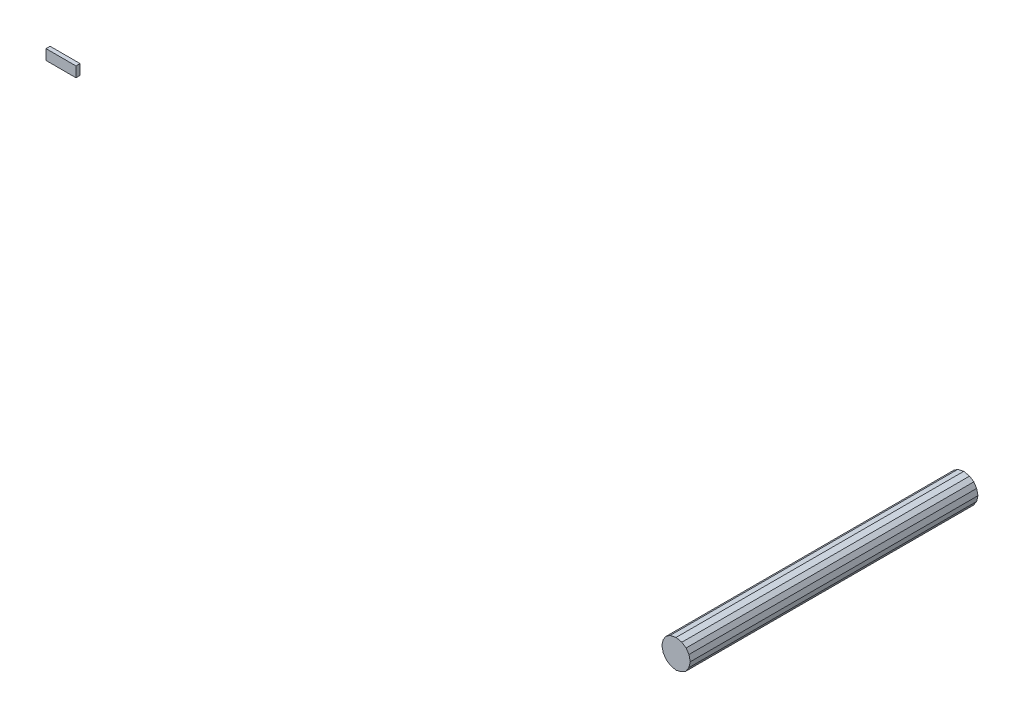
ISO-10303-21;
HEADER;
FILE_DESCRIPTION(('STEP AP214'),'2;1');
FILE_NAME('part.step','',(''),(''),'','','');
FILE_SCHEMA(('AUTOMOTIVE_DESIGN { 1 0 10303 214 1 1 1 1 }'));
ENDSEC;
DATA;
#1=APPLICATION_CONTEXT('core data for automotive mechanical design processes');
#2=APPLICATION_PROTOCOL_DEFINITION('international standard','automotive_design',2000,#1);
#3=PRODUCT_CONTEXT('',#1,'mechanical');
#4=PRODUCT('Part','Part','',(#3));
#5=PRODUCT_RELATED_PRODUCT_CATEGORY('part','',(#4));
#6=PRODUCT_DEFINITION_FORMATION('','',#4);
#7=PRODUCT_DEFINITION_CONTEXT('part definition',#1,'design');
#8=PRODUCT_DEFINITION('design','',#6,#7);
#9=PRODUCT_DEFINITION_SHAPE('','',#8);
#10=(LENGTH_UNIT() NAMED_UNIT(*) SI_UNIT(.MILLI.,.METRE.));
#11=(NAMED_UNIT(*) PLANE_ANGLE_UNIT() SI_UNIT($,.RADIAN.));
#12=(NAMED_UNIT(*) SI_UNIT($,.STERADIAN.) SOLID_ANGLE_UNIT());
#13=UNCERTAINTY_MEASURE_WITH_UNIT(LENGTH_MEASURE(1.E-05),#10,'distance_accuracy_value','');
#14=(GEOMETRIC_REPRESENTATION_CONTEXT(3) GLOBAL_UNCERTAINTY_ASSIGNED_CONTEXT((#13)) GLOBAL_UNIT_ASSIGNED_CONTEXT((#10,
#11,#12)) REPRESENTATION_CONTEXT('',''));
#15=CARTESIAN_POINT('',(0.,0.,0.));
#16=DIRECTION('',(0.,0.,1.));
#17=DIRECTION('',(1.,0.,0.));
#18=AXIS2_PLACEMENT_3D('',#15,#16,#17);
#19=CARTESIAN_POINT('',(37.113689223164,20.449887465869,9.000000650735));
#20=DIRECTION('',(0.,0.,1.));
#21=DIRECTION('',(1.,0.,0.));
#22=AXIS2_PLACEMENT_3D('',#19,#20,#21);
#23=PLANE('',#22);
#24=DIRECTION('',(-0.860789441871855,-0.508961233063914,0.));
#25=VECTOR('',#24,1.);
#26=CARTESIAN_POINT('',(37.294715023164,20.556923065869,9.000000650735));
#27=LINE('',#26,#25);
#28=CARTESIAN_POINT('',(37.294715023164,20.556923065869,9.000000650735));
#29=VERTEX_POINT('',#28);
#30=CARTESIAN_POINT('',(37.113689223164,20.449887465869,9.000000650735));
#31=VERTEX_POINT('',#30);
#32=EDGE_CURVE('P0_E26',#29,#31,#27,.T.);
#33=ORIENTED_EDGE('',*,*,#32,.F.);
#34=DIRECTION('',(-0.539246404118153,-0.842148036657239,0.));
#35=VECTOR('',#34,1.);
#36=CARTESIAN_POINT('',(37.405636823164,20.730151065869,9.000000650735));
#37=LINE('',#36,#35);
#38=CARTESIAN_POINT('',(37.405636823164,20.730151065869,9.000000650735));
#39=VERTEX_POINT('',#38);
#40=EDGE_CURVE('P0_E184',#39,#29,#37,.T.);
#41=ORIENTED_EDGE('',*,*,#40,.F.);
#42=DIRECTION('',(-0.707106781186548,-0.707106781186548,0.));
#43=VECTOR('',#42,1.);
#44=CARTESIAN_POINT('',(37.415390423164,20.739904665869,9.000000650735));
#45=LINE('',#44,#43);
#46=CARTESIAN_POINT('',(37.415390423164,20.739904665869,9.000000650735));
#47=VERTEX_POINT('',#46);
#48=EDGE_CURVE('P0_E186',#47,#39,#45,.T.);
#49=ORIENTED_EDGE('',*,*,#48,.F.);
#50=DIRECTION('',(-0.228497344288947,-0.973544536039774,0.));
#51=VECTOR('',#50,1.);
#52=CARTESIAN_POINT('',(37.467917623164,20.963704065869,9.000000650735));
#53=LINE('',#52,#51);
#54=CARTESIAN_POINT('',(37.467917623164,20.963704065869,9.000000650735));
#55=VERTEX_POINT('',#54);
#56=EDGE_CURVE('P0_E214',#55,#47,#53,.T.);
#57=ORIENTED_EDGE('',*,*,#56,.F.);
#58=DIRECTION('',(0.234264017035985,-0.972173014602938,0.));
#59=VECTOR('',#58,1.);
#60=CARTESIAN_POINT('',(37.415390423164,21.181686865869,9.000000650735));
#61=LINE('',#60,#59);
#62=CARTESIAN_POINT('',(37.415390423164,21.181686865869,9.000000650735));
#63=VERTEX_POINT('',#62);
#64=EDGE_CURVE('P0_E220',#63,#55,#61,.T.);
#65=ORIENTED_EDGE('',*,*,#64,.F.);
#66=DIRECTION('',(0.545689782249991,-0.837987268129986,0.));
#67=VECTOR('',#66,1.);
#68=CARTESIAN_POINT('',(37.306373623164,21.349098265869,9.000000650735));
#69=LINE('',#68,#67);
#70=CARTESIAN_POINT('',(37.306373623164,21.349098265869,9.000000650735));
#71=VERTEX_POINT('',#70);
#72=EDGE_CURVE('P0_E228',#71,#63,#69,.T.);
#73=ORIENTED_EDGE('',*,*,#72,.F.);
#74=DIRECTION('',(0.838007550608019,-0.545658634243012,0.));
#75=VECTOR('',#74,1.);
#76=CARTESIAN_POINT('',(37.138987623164,21.458089665869,9.000000650735));
#77=LINE('',#76,#75);
#78=CARTESIAN_POINT('',(37.138987623164,21.458089665869,9.000000650735));
#79=VERTEX_POINT('',#78);
#80=EDGE_CURVE('P0_E236',#79,#71,#77,.T.);
#81=ORIENTED_EDGE('',*,*,#80,.F.);
#82=DIRECTION('',(0.975388808551702,-0.220491886816932,0.));
#83=VECTOR('',#82,1.);
#84=CARTESIAN_POINT('',(36.915162823164,21.508686465869,9.000000650735));
#85=LINE('',#84,#83);
#86=CARTESIAN_POINT('',(36.915162823164,21.508686465869,9.000000650735));
#87=VERTEX_POINT('',#86);
#88=EDGE_CURVE('P0_E244',#87,#79,#85,.T.);
#89=ORIENTED_EDGE('',*,*,#88,.F.);
#90=DIRECTION('',(0.977328638870001,0.211727966137001,0.));
#91=VECTOR('',#90,1.);
#92=CARTESIAN_POINT('',(36.681609823164,21.458089665869,9.000000650735));
#93=LINE('',#92,#91);
#94=CARTESIAN_POINT('',(36.681609823164,21.458089665869,9.000000650735));
#95=VERTEX_POINT('',#94);
#96=EDGE_CURVE('P0_E252',#95,#87,#93,.T.);
#97=ORIENTED_EDGE('',*,*,#96,.F.);
#98=DIRECTION('',(0.825574759558204,0.564292757689139,0.));
#99=VECTOR('',#98,1.);
#100=CARTESIAN_POINT('',(36.527838223164,21.352984465869,9.000000650735));
#101=LINE('',#100,#99);
#102=CARTESIAN_POINT('',(36.527838223164,21.352984465869,9.000000650735));
#103=VERTEX_POINT('',#102);
#104=EDGE_CURVE('P0_E260',#103,#95,#101,.T.);
#105=ORIENTED_EDGE('',*,*,#104,.F.);
#106=DIRECTION('',(0.57474998902595,0.818329059800928,0.));
#107=VECTOR('',#106,1.);
#108=CARTESIAN_POINT('',(36.413004823164,21.189484665869,9.000000650735));
#109=LINE('',#108,#107);
#110=CARTESIAN_POINT('',(36.413004823164,21.189484665869,9.000000650735));
#111=VERTEX_POINT('',#110);
#112=EDGE_CURVE('P0_E268',#111,#103,#109,.T.);
#113=ORIENTED_EDGE('',*,*,#112,.F.);
#114=DIRECTION('',(0.220491886816932,0.975388808551702,0.));
#115=VECTOR('',#114,1.);
#116=CARTESIAN_POINT('',(36.362408023164,20.965659865869,9.000000650735));
#117=LINE('',#116,#115);
#118=CARTESIAN_POINT('',(36.362408023164,20.965659865869,9.000000650735));
#119=VERTEX_POINT('',#118);
#120=EDGE_CURVE('P0_E276',#119,#111,#117,.T.);
#121=ORIENTED_EDGE('',*,*,#120,.F.);
#122=DIRECTION('',(-0.220491886816932,0.975388808551702,0.));
#123=VECTOR('',#122,1.);
#124=CARTESIAN_POINT('',(36.413004823164,20.741835065869,9.000000650735));
#125=LINE('',#124,#123);
#126=CARTESIAN_POINT('',(36.413004823164,20.741835065869,9.000000650735));
#127=VERTEX_POINT('',#126);
#128=EDGE_CURVE('P0_E284',#127,#119,#125,.T.);
#129=ORIENTED_EDGE('',*,*,#128,.F.);
#130=DIRECTION('',(-0.560904658136019,0.827880404697028,0.));
#131=VECTOR('',#130,1.);
#132=CARTESIAN_POINT('',(36.535636023164,20.560834665869,9.000000650735));
#133=LINE('',#132,#131);
#134=CARTESIAN_POINT('',(36.535636023164,20.560834665869,9.000000650735));
#135=VERTEX_POINT('',#134);
#136=EDGE_CURVE('P0_E292',#135,#127,#133,.T.);
#137=ORIENTED_EDGE('',*,*,#136,.F.);
#138=DIRECTION('',(-0.836425426544044,0.548080747546029,0.));
#139=VECTOR('',#138,1.);
#140=CARTESIAN_POINT('',(36.704952423164,20.449887465869,9.000000650735));
#141=LINE('',#140,#139);
#142=CARTESIAN_POINT('',(36.704952423164,20.449887465869,9.000000650735));
#143=VERTEX_POINT('',#142);
#144=EDGE_CURVE('P0_E300',#143,#135,#141,.T.);
#145=ORIENTED_EDGE('',*,*,#144,.F.);
#146=DIRECTION('',(-0.972798430578044,0.23165321811901,0.));
#147=VECTOR('',#146,1.);
#148=CARTESIAN_POINT('',(36.909320823164,20.401221065869,9.000000650735));
#149=LINE('',#148,#147);
#150=CARTESIAN_POINT('',(36.909320823164,20.401221065869,9.000000650735));
#151=VERTEX_POINT('',#150);
#152=EDGE_CURVE('P0_E65',#151,#143,#149,.T.);
#153=ORIENTED_EDGE('',*,*,#152,.F.);
#154=DIRECTION('',(-0.972798430578044,-0.23165321811901,0.));
#155=VECTOR('',#154,1.);
#156=CARTESIAN_POINT('',(37.113689223164,20.449887465869,9.000000650735));
#157=LINE('',#156,#155);
#158=EDGE_CURVE('P0_E313',#31,#151,#157,.T.);
#159=ORIENTED_EDGE('',*,*,#158,.F.);
#160=EDGE_LOOP('',(#33,#41,#49,#57,#65,#73,#81,#89,#97,#105,#113,#121,#129,#137,#145,#153,#159));
#161=FACE_BOUND('',#160,.T.);
#162=ADVANCED_FACE('P0_F16',(#161),#23,.T.);
#163=CARTESIAN_POINT('',(37.113689223164,20.449887465869,-2.199999809265));
#164=DIRECTION('',(0.,0.,1.));
#165=DIRECTION('',(1.,0.,0.));
#166=AXIS2_PLACEMENT_3D('',#163,#164,#165);
#167=PLANE('',#166);
#168=DIRECTION('',(-0.972798430578044,-0.23165321811901,0.));
#169=VECTOR('',#168,1.);
#170=CARTESIAN_POINT('',(37.113689223164,20.449887465869,-2.199999809265));
#171=LINE('',#170,#169);
#172=CARTESIAN_POINT('',(37.113689223164,20.449887465869,-2.199999809265));
#173=VERTEX_POINT('',#172);
#174=CARTESIAN_POINT('',(36.909320823164,20.401221065869,-2.199999809265));
#175=VERTEX_POINT('',#174);
#176=EDGE_CURVE('P0_E311',#173,#175,#171,.T.);
#177=ORIENTED_EDGE('',*,*,#176,.T.);
#178=DIRECTION('',(-0.972798430578044,0.23165321811901,0.));
#179=VECTOR('',#178,1.);
#180=CARTESIAN_POINT('',(36.909320823164,20.401221065869,-2.199999809265));
#181=LINE('',#180,#179);
#182=CARTESIAN_POINT('',(36.704952423164,20.449887465869,-2.199999809265));
#183=VERTEX_POINT('',#182);
#184=EDGE_CURVE('P0_E305',#175,#183,#181,.T.);
#185=ORIENTED_EDGE('',*,*,#184,.T.);
#186=DIRECTION('',(-0.836425426544044,0.548080747546029,0.));
#187=VECTOR('',#186,1.);
#188=CARTESIAN_POINT('',(36.704952423164,20.449887465869,-2.199999809265));
#189=LINE('',#188,#187);
#190=CARTESIAN_POINT('',(36.535636023164,20.560834665869,-2.199999809265));
#191=VERTEX_POINT('',#190);
#192=EDGE_CURVE('P0_E297',#183,#191,#189,.T.);
#193=ORIENTED_EDGE('',*,*,#192,.T.);
#194=DIRECTION('',(-0.560904658136019,0.827880404697028,0.));
#195=VECTOR('',#194,1.);
#196=CARTESIAN_POINT('',(36.535636023164,20.560834665869,-2.199999809265));
#197=LINE('',#196,#195);
#198=CARTESIAN_POINT('',(36.413004823164,20.741835065869,-2.199999809265));
#199=VERTEX_POINT('',#198);
#200=EDGE_CURVE('P0_E289',#191,#199,#197,.T.);
#201=ORIENTED_EDGE('',*,*,#200,.T.);
#202=DIRECTION('',(-0.220491886816932,0.975388808551702,0.));
#203=VECTOR('',#202,1.);
#204=CARTESIAN_POINT('',(36.413004823164,20.741835065869,-2.199999809265));
#205=LINE('',#204,#203);
#206=CARTESIAN_POINT('',(36.362408023164,20.965659865869,-2.199999809265));
#207=VERTEX_POINT('',#206);
#208=EDGE_CURVE('P0_E281',#199,#207,#205,.T.);
#209=ORIENTED_EDGE('',*,*,#208,.T.);
#210=DIRECTION('',(0.220491886816932,0.975388808551702,0.));
#211=VECTOR('',#210,1.);
#212=CARTESIAN_POINT('',(36.362408023164,20.965659865869,-2.199999809265));
#213=LINE('',#212,#211);
#214=CARTESIAN_POINT('',(36.413004823164,21.189484665869,-2.199999809265));
#215=VERTEX_POINT('',#214);
#216=EDGE_CURVE('P0_E273',#207,#215,#213,.T.);
#217=ORIENTED_EDGE('',*,*,#216,.T.);
#218=DIRECTION('',(0.57474998902595,0.818329059800928,0.));
#219=VECTOR('',#218,1.);
#220=CARTESIAN_POINT('',(36.413004823164,21.189484665869,-2.199999809265));
#221=LINE('',#220,#219);
#222=CARTESIAN_POINT('',(36.527838223164,21.352984465869,-2.199999809265));
#223=VERTEX_POINT('',#222);
#224=EDGE_CURVE('P0_E265',#215,#223,#221,.T.);
#225=ORIENTED_EDGE('',*,*,#224,.T.);
#226=DIRECTION('',(0.825574759558204,0.564292757689139,0.));
#227=VECTOR('',#226,1.);
#228=CARTESIAN_POINT('',(36.527838223164,21.352984465869,-2.199999809265));
#229=LINE('',#228,#227);
#230=CARTESIAN_POINT('',(36.681609823164,21.458089665869,-2.199999809265));
#231=VERTEX_POINT('',#230);
#232=EDGE_CURVE('P0_E257',#223,#231,#229,.T.);
#233=ORIENTED_EDGE('',*,*,#232,.T.);
#234=DIRECTION('',(0.977328638870001,0.211727966137001,0.));
#235=VECTOR('',#234,1.);
#236=CARTESIAN_POINT('',(36.681609823164,21.458089665869,-2.199999809265));
#237=LINE('',#236,#235);
#238=CARTESIAN_POINT('',(36.915162823164,21.508686465869,-2.199999809265));
#239=VERTEX_POINT('',#238);
#240=EDGE_CURVE('P0_E249',#231,#239,#237,.T.);
#241=ORIENTED_EDGE('',*,*,#240,.T.);
#242=DIRECTION('',(0.975388808551702,-0.220491886816932,0.));
#243=VECTOR('',#242,1.);
#244=CARTESIAN_POINT('',(36.915162823164,21.508686465869,-2.199999809265));
#245=LINE('',#244,#243);
#246=CARTESIAN_POINT('',(37.138987623164,21.458089665869,-2.199999809265));
#247=VERTEX_POINT('',#246);
#248=EDGE_CURVE('P0_E241',#239,#247,#245,.T.);
#249=ORIENTED_EDGE('',*,*,#248,.T.);
#250=DIRECTION('',(0.838007550608019,-0.545658634243012,0.));
#251=VECTOR('',#250,1.);
#252=CARTESIAN_POINT('',(37.138987623164,21.458089665869,-2.199999809265));
#253=LINE('',#252,#251);
#254=CARTESIAN_POINT('',(37.306373623164,21.349098265869,-2.199999809265));
#255=VERTEX_POINT('',#254);
#256=EDGE_CURVE('P0_E233',#247,#255,#253,.T.);
#257=ORIENTED_EDGE('',*,*,#256,.T.);
#258=DIRECTION('',(0.545689782249991,-0.837987268129986,0.));
#259=VECTOR('',#258,1.);
#260=CARTESIAN_POINT('',(37.306373623164,21.349098265869,-2.199999809265));
#261=LINE('',#260,#259);
#262=CARTESIAN_POINT('',(37.415390423164,21.181686865869,-2.199999809265));
#263=VERTEX_POINT('',#262);
#264=EDGE_CURVE('P0_E225',#255,#263,#261,.T.);
#265=ORIENTED_EDGE('',*,*,#264,.T.);
#266=DIRECTION('',(0.234264017035985,-0.972173014602938,0.));
#267=VECTOR('',#266,1.);
#268=CARTESIAN_POINT('',(37.415390423164,21.181686865869,-2.199999809265));
#269=LINE('',#268,#267);
#270=CARTESIAN_POINT('',(37.467917623164,20.963704065869,-2.199999809265));
#271=VERTEX_POINT('',#270);
#272=EDGE_CURVE('P0_E217',#263,#271,#269,.T.);
#273=ORIENTED_EDGE('',*,*,#272,.T.);
#274=DIRECTION('',(-0.228497344288947,-0.973544536039774,0.));
#275=VECTOR('',#274,1.);
#276=CARTESIAN_POINT('',(37.467917623164,20.963704065869,-2.199999809265));
#277=LINE('',#276,#275);
#278=CARTESIAN_POINT('',(37.415390423164,20.739904665869,-2.199999809265));
#279=VERTEX_POINT('',#278);
#280=EDGE_CURVE('P0_E203',#271,#279,#277,.T.);
#281=ORIENTED_EDGE('',*,*,#280,.T.);
#282=DIRECTION('',(-0.707106781186548,-0.707106781186548,0.));
#283=VECTOR('',#282,1.);
#284=CARTESIAN_POINT('',(37.415390423164,20.739904665869,-2.199999809265));
#285=LINE('',#284,#283);
#286=CARTESIAN_POINT('',(37.405636823164,20.730151065869,-2.199999809265));
#287=VERTEX_POINT('',#286);
#288=EDGE_CURVE('P0_E190',#279,#287,#285,.T.);
#289=ORIENTED_EDGE('',*,*,#288,.T.);
#290=DIRECTION('',(-0.539246404118153,-0.842148036657239,0.));
#291=VECTOR('',#290,1.);
#292=CARTESIAN_POINT('',(37.405636823164,20.730151065869,-2.199999809265));
#293=LINE('',#292,#291);
#294=CARTESIAN_POINT('',(37.294715023164,20.556923065869,-2.199999809265));
#295=VERTEX_POINT('',#294);
#296=EDGE_CURVE('P0_E179',#287,#295,#293,.T.);
#297=ORIENTED_EDGE('',*,*,#296,.T.);
#298=DIRECTION('',(-0.860789441871855,-0.508961233063914,0.));
#299=VECTOR('',#298,1.);
#300=CARTESIAN_POINT('',(37.294715023164,20.556923065869,-2.199999809265));
#301=LINE('',#300,#299);
#302=EDGE_CURVE('P0_E11',#295,#173,#301,.T.);
#303=ORIENTED_EDGE('',*,*,#302,.T.);
#304=EDGE_LOOP('',(#177,#185,#193,#201,#209,#217,#225,#233,#241,#249,#257,#265,#273,#281,#289,
#297,#303));
#305=FACE_BOUND('',#304,.T.);
#306=ADVANCED_FACE('P0_F501',(#305),#167,.F.);
#307=CARTESIAN_POINT('',(37.294715023164,20.556923065869,-2.199999809265));
#308=DIRECTION('',(0.508961233063914,-0.860789441871855,0.));
#309=DIRECTION('',(-0.860789441871855,-0.508961233063914,0.));
#310=AXIS2_PLACEMENT_3D('',#307,#308,#309);
#311=PLANE('',#310);
#312=DIRECTION('',(0.,0.,1.));
#313=VECTOR('',#312,1.);
#314=CARTESIAN_POINT('',(37.294715023164,20.556923065869,-2.199999809265));
#315=LINE('',#314,#313);
#316=EDGE_CURVE('P0_E189',#295,#29,#315,.T.);
#317=ORIENTED_EDGE('',*,*,#316,.T.);
#318=ORIENTED_EDGE('',*,*,#32,.T.);
#319=DIRECTION('',(0.,0.,1.));
#320=VECTOR('',#319,1.);
#321=CARTESIAN_POINT('',(37.113689223164,20.449887465869,-2.199999809265));
#322=LINE('',#321,#320);
#323=EDGE_CURVE('P0_E317',#173,#31,#322,.T.);
#324=ORIENTED_EDGE('',*,*,#323,.F.);
#325=ORIENTED_EDGE('',*,*,#302,.F.);
#326=EDGE_LOOP('',(#317,#318,#324,#325));
#327=FACE_BOUND('',#326,.T.);
#328=ADVANCED_FACE('P0_F499',(#327),#311,.T.);
#329=CARTESIAN_POINT('',(37.405636823164,20.730151065869,-2.199999809265));
#330=DIRECTION('',(0.842148036657239,-0.539246404118153,0.));
#331=DIRECTION('',(-0.539246404118153,-0.842148036657239,0.));
#332=AXIS2_PLACEMENT_3D('',#329,#330,#331);
#333=PLANE('',#332);
#334=DIRECTION('',(0.,0.,1.));
#335=VECTOR('',#334,1.);
#336=CARTESIAN_POINT('',(37.405636823164,20.730151065869,-2.199999809265));
#337=LINE('',#336,#335);
#338=EDGE_CURVE('P0_E193',#287,#39,#337,.T.);
#339=ORIENTED_EDGE('',*,*,#338,.T.);
#340=ORIENTED_EDGE('',*,*,#40,.T.);
#341=ORIENTED_EDGE('',*,*,#316,.F.);
#342=ORIENTED_EDGE('',*,*,#296,.F.);
#343=EDGE_LOOP('',(#339,#340,#341,#342));
#344=FACE_BOUND('',#343,.T.);
#345=ADVANCED_FACE('P0_F194',(#344),#333,.T.);
#346=CARTESIAN_POINT('',(37.415390423164,20.739904665869,-2.199999809265));
#347=DIRECTION('',(0.707106781186548,-0.707106781186548,0.));
#348=DIRECTION('',(-0.707106781186548,-0.707106781186548,0.));
#349=AXIS2_PLACEMENT_3D('',#346,#347,#348);
#350=PLANE('',#349);
#351=DIRECTION('',(0.,0.,1.));
#352=VECTOR('',#351,1.);
#353=CARTESIAN_POINT('',(37.415390423164,20.739904665869,-2.199999809265));
#354=LINE('',#353,#352);
#355=EDGE_CURVE('P0_E200',#279,#47,#354,.T.);
#356=ORIENTED_EDGE('',*,*,#355,.T.);
#357=ORIENTED_EDGE('',*,*,#48,.T.);
#358=ORIENTED_EDGE('',*,*,#338,.F.);
#359=ORIENTED_EDGE('',*,*,#288,.F.);
#360=EDGE_LOOP('',(#356,#357,#358,#359));
#361=FACE_BOUND('',#360,.T.);
#362=ADVANCED_FACE('P0_F198',(#361),#350,.T.);
#363=CARTESIAN_POINT('',(37.467917623164,20.963704065869,-2.199999809265));
#364=DIRECTION('',(0.973544536039774,-0.228497344288947,0.));
#365=DIRECTION('',(-0.228497344288947,-0.973544536039774,0.));
#366=AXIS2_PLACEMENT_3D('',#363,#364,#365);
#367=PLANE('',#366);
#368=DIRECTION('',(0.,0.,1.));
#369=VECTOR('',#368,1.);
#370=CARTESIAN_POINT('',(37.467917623164,20.963704065869,-2.199999809265));
#371=LINE('',#370,#369);
#372=EDGE_CURVE('P0_E224',#271,#55,#371,.T.);
#373=ORIENTED_EDGE('',*,*,#372,.T.);
#374=ORIENTED_EDGE('',*,*,#56,.T.);
#375=ORIENTED_EDGE('',*,*,#355,.F.);
#376=ORIENTED_EDGE('',*,*,#280,.F.);
#377=EDGE_LOOP('',(#373,#374,#375,#376));
#378=FACE_BOUND('',#377,.T.);
#379=ADVANCED_FACE('P0_F543',(#378),#367,.T.);
#380=CARTESIAN_POINT('',(37.415390423164,21.181686865869,-2.199999809265));
#381=DIRECTION('',(0.972173014602938,0.234264017035985,0.));
#382=DIRECTION('',(0.234264017035985,-0.972173014602938,0.));
#383=AXIS2_PLACEMENT_3D('',#380,#381,#382);
#384=PLANE('',#383);
#385=DIRECTION('',(0.,0.,1.));
#386=VECTOR('',#385,1.);
#387=CARTESIAN_POINT('',(37.415390423164,21.181686865869,-2.199999809265));
#388=LINE('',#387,#386);
#389=EDGE_CURVE('P0_E232',#263,#63,#388,.T.);
#390=ORIENTED_EDGE('',*,*,#389,.T.);
#391=ORIENTED_EDGE('',*,*,#64,.T.);
#392=ORIENTED_EDGE('',*,*,#372,.F.);
#393=ORIENTED_EDGE('',*,*,#272,.F.);
#394=EDGE_LOOP('',(#390,#391,#392,#393));
#395=FACE_BOUND('',#394,.T.);
#396=ADVANCED_FACE('P0_F553',(#395),#384,.T.);
#397=CARTESIAN_POINT('',(37.306373623164,21.349098265869,-2.199999809265));
#398=DIRECTION('',(0.837987268129986,0.545689782249991,0.));
#399=DIRECTION('',(0.545689782249991,-0.837987268129986,0.));
#400=AXIS2_PLACEMENT_3D('',#397,#398,#399);
#401=PLANE('',#400);
#402=DIRECTION('',(0.,0.,1.));
#403=VECTOR('',#402,1.);
#404=CARTESIAN_POINT('',(37.306373623164,21.349098265869,-2.199999809265));
#405=LINE('',#404,#403);
#406=EDGE_CURVE('P0_E240',#255,#71,#405,.T.);
#407=ORIENTED_EDGE('',*,*,#406,.T.);
#408=ORIENTED_EDGE('',*,*,#72,.T.);
#409=ORIENTED_EDGE('',*,*,#389,.F.);
#410=ORIENTED_EDGE('',*,*,#264,.F.);
#411=EDGE_LOOP('',(#407,#408,#409,#410));
#412=FACE_BOUND('',#411,.T.);
#413=ADVANCED_FACE('P0_F564',(#412),#401,.T.);
#414=CARTESIAN_POINT('',(37.138987623164,21.458089665869,-2.199999809265));
#415=DIRECTION('',(0.545658634243012,0.838007550608019,0.));
#416=DIRECTION('',(0.838007550608019,-0.545658634243012,0.));
#417=AXIS2_PLACEMENT_3D('',#414,#415,#416);
#418=PLANE('',#417);
#419=DIRECTION('',(0.,0.,1.));
#420=VECTOR('',#419,1.);
#421=CARTESIAN_POINT('',(37.138987623164,21.458089665869,-2.199999809265));
#422=LINE('',#421,#420);
#423=EDGE_CURVE('P0_E248',#247,#79,#422,.T.);
#424=ORIENTED_EDGE('',*,*,#423,.T.);
#425=ORIENTED_EDGE('',*,*,#80,.T.);
#426=ORIENTED_EDGE('',*,*,#406,.F.);
#427=ORIENTED_EDGE('',*,*,#256,.F.);
#428=EDGE_LOOP('',(#424,#425,#426,#427));
#429=FACE_BOUND('',#428,.T.);
#430=ADVANCED_FACE('P0_F575',(#429),#418,.T.);
#431=CARTESIAN_POINT('',(36.915162823164,21.508686465869,-2.199999809265));
#432=DIRECTION('',(0.220491886816932,0.975388808551702,0.));
#433=DIRECTION('',(0.975388808551702,-0.220491886816932,0.));
#434=AXIS2_PLACEMENT_3D('',#431,#432,#433);
#435=PLANE('',#434);
#436=DIRECTION('',(0.,0.,1.));
#437=VECTOR('',#436,1.);
#438=CARTESIAN_POINT('',(36.915162823164,21.508686465869,-2.199999809265));
#439=LINE('',#438,#437);
#440=EDGE_CURVE('P0_E256',#239,#87,#439,.T.);
#441=ORIENTED_EDGE('',*,*,#440,.T.);
#442=ORIENTED_EDGE('',*,*,#88,.T.);
#443=ORIENTED_EDGE('',*,*,#423,.F.);
#444=ORIENTED_EDGE('',*,*,#248,.F.);
#445=EDGE_LOOP('',(#441,#442,#443,#444));
#446=FACE_BOUND('',#445,.T.);
#447=ADVANCED_FACE('P0_F586',(#446),#435,.T.);
#448=CARTESIAN_POINT('',(36.681609823164,21.458089665869,-2.199999809265));
#449=DIRECTION('',(-0.211727966137001,0.977328638870001,0.));
#450=DIRECTION('',(0.977328638870001,0.211727966137001,0.));
#451=AXIS2_PLACEMENT_3D('',#448,#449,#450);
#452=PLANE('',#451);
#453=DIRECTION('',(0.,0.,1.));
#454=VECTOR('',#453,1.);
#455=CARTESIAN_POINT('',(36.681609823164,21.458089665869,-2.199999809265));
#456=LINE('',#455,#454);
#457=EDGE_CURVE('P0_E264',#231,#95,#456,.T.);
#458=ORIENTED_EDGE('',*,*,#457,.T.);
#459=ORIENTED_EDGE('',*,*,#96,.T.);
#460=ORIENTED_EDGE('',*,*,#440,.F.);
#461=ORIENTED_EDGE('',*,*,#240,.F.);
#462=EDGE_LOOP('',(#458,#459,#460,#461));
#463=FACE_BOUND('',#462,.T.);
#464=ADVANCED_FACE('P0_F597',(#463),#452,.T.);
#465=CARTESIAN_POINT('',(36.527838223164,21.352984465869,-2.199999809265));
#466=DIRECTION('',(-0.564292757689139,0.825574759558204,0.));
#467=DIRECTION('',(0.825574759558204,0.564292757689139,0.));
#468=AXIS2_PLACEMENT_3D('',#465,#466,#467);
#469=PLANE('',#468);
#470=DIRECTION('',(0.,0.,1.));
#471=VECTOR('',#470,1.);
#472=CARTESIAN_POINT('',(36.527838223164,21.352984465869,-2.199999809265));
#473=LINE('',#472,#471);
#474=EDGE_CURVE('P0_E272',#223,#103,#473,.T.);
#475=ORIENTED_EDGE('',*,*,#474,.T.);
#476=ORIENTED_EDGE('',*,*,#104,.T.);
#477=ORIENTED_EDGE('',*,*,#457,.F.);
#478=ORIENTED_EDGE('',*,*,#232,.F.);
#479=EDGE_LOOP('',(#475,#476,#477,#478));
#480=FACE_BOUND('',#479,.T.);
#481=ADVANCED_FACE('P0_F608',(#480),#469,.T.);
#482=CARTESIAN_POINT('',(36.413004823164,21.189484665869,-2.199999809265));
#483=DIRECTION('',(-0.818329059800928,0.57474998902595,0.));
#484=DIRECTION('',(0.57474998902595,0.818329059800928,0.));
#485=AXIS2_PLACEMENT_3D('',#482,#483,#484);
#486=PLANE('',#485);
#487=DIRECTION('',(0.,0.,1.));
#488=VECTOR('',#487,1.);
#489=CARTESIAN_POINT('',(36.413004823164,21.189484665869,-2.199999809265));
#490=LINE('',#489,#488);
#491=EDGE_CURVE('P0_E280',#215,#111,#490,.T.);
#492=ORIENTED_EDGE('',*,*,#491,.T.);
#493=ORIENTED_EDGE('',*,*,#112,.T.);
#494=ORIENTED_EDGE('',*,*,#474,.F.);
#495=ORIENTED_EDGE('',*,*,#224,.F.);
#496=EDGE_LOOP('',(#492,#493,#494,#495));
#497=FACE_BOUND('',#496,.T.);
#498=ADVANCED_FACE('P0_F619',(#497),#486,.T.);
#499=CARTESIAN_POINT('',(36.362408023164,20.965659865869,-2.199999809265));
#500=DIRECTION('',(-0.975388808551702,0.220491886816932,0.));
#501=DIRECTION('',(0.220491886816932,0.975388808551702,0.));
#502=AXIS2_PLACEMENT_3D('',#499,#500,#501);
#503=PLANE('',#502);
#504=DIRECTION('',(0.,0.,1.));
#505=VECTOR('',#504,1.);
#506=CARTESIAN_POINT('',(36.362408023164,20.965659865869,-2.199999809265));
#507=LINE('',#506,#505);
#508=EDGE_CURVE('P0_E288',#207,#119,#507,.T.);
#509=ORIENTED_EDGE('',*,*,#508,.T.);
#510=ORIENTED_EDGE('',*,*,#120,.T.);
#511=ORIENTED_EDGE('',*,*,#491,.F.);
#512=ORIENTED_EDGE('',*,*,#216,.F.);
#513=EDGE_LOOP('',(#509,#510,#511,#512));
#514=FACE_BOUND('',#513,.T.);
#515=ADVANCED_FACE('P0_F630',(#514),#503,.T.);
#516=CARTESIAN_POINT('',(36.413004823164,20.741835065869,-2.199999809265));
#517=DIRECTION('',(-0.975388808551702,-0.220491886816932,0.));
#518=DIRECTION('',(-0.220491886816932,0.975388808551702,0.));
#519=AXIS2_PLACEMENT_3D('',#516,#517,#518);
#520=PLANE('',#519);
#521=DIRECTION('',(0.,0.,1.));
#522=VECTOR('',#521,1.);
#523=CARTESIAN_POINT('',(36.413004823164,20.741835065869,-2.199999809265));
#524=LINE('',#523,#522);
#525=EDGE_CURVE('P0_E296',#199,#127,#524,.T.);
#526=ORIENTED_EDGE('',*,*,#525,.T.);
#527=ORIENTED_EDGE('',*,*,#128,.T.);
#528=ORIENTED_EDGE('',*,*,#508,.F.);
#529=ORIENTED_EDGE('',*,*,#208,.F.);
#530=EDGE_LOOP('',(#526,#527,#528,#529));
#531=FACE_BOUND('',#530,.T.);
#532=ADVANCED_FACE('P0_F641',(#531),#520,.T.);
#533=CARTESIAN_POINT('',(36.535636023164,20.560834665869,-2.199999809265));
#534=DIRECTION('',(-0.827880404697028,-0.560904658136019,0.));
#535=DIRECTION('',(-0.560904658136019,0.827880404697028,0.));
#536=AXIS2_PLACEMENT_3D('',#533,#534,#535);
#537=PLANE('',#536);
#538=DIRECTION('',(0.,0.,1.));
#539=VECTOR('',#538,1.);
#540=CARTESIAN_POINT('',(36.535636023164,20.560834665869,-2.199999809265));
#541=LINE('',#540,#539);
#542=EDGE_CURVE('P0_E304',#191,#135,#541,.T.);
#543=ORIENTED_EDGE('',*,*,#542,.T.);
#544=ORIENTED_EDGE('',*,*,#136,.T.);
#545=ORIENTED_EDGE('',*,*,#525,.F.);
#546=ORIENTED_EDGE('',*,*,#200,.F.);
#547=EDGE_LOOP('',(#543,#544,#545,#546));
#548=FACE_BOUND('',#547,.T.);
#549=ADVANCED_FACE('P0_F652',(#548),#537,.T.);
#550=CARTESIAN_POINT('',(36.704952423164,20.449887465869,-2.199999809265));
#551=DIRECTION('',(-0.548080747546029,-0.836425426544044,0.));
#552=DIRECTION('',(-0.836425426544044,0.548080747546029,0.));
#553=AXIS2_PLACEMENT_3D('',#550,#551,#552);
#554=PLANE('',#553);
#555=DIRECTION('',(0.,0.,1.));
#556=VECTOR('',#555,1.);
#557=CARTESIAN_POINT('',(36.704952423164,20.449887465869,-2.199999809265));
#558=LINE('',#557,#556);
#559=EDGE_CURVE('P0_E310',#183,#143,#558,.T.);
#560=ORIENTED_EDGE('',*,*,#559,.T.);
#561=ORIENTED_EDGE('',*,*,#144,.T.);
#562=ORIENTED_EDGE('',*,*,#542,.F.);
#563=ORIENTED_EDGE('',*,*,#192,.F.);
#564=EDGE_LOOP('',(#560,#561,#562,#563));
#565=FACE_BOUND('',#564,.T.);
#566=ADVANCED_FACE('P0_F494',(#565),#554,.T.);
#567=CARTESIAN_POINT('',(36.909320823164,20.401221065869,-2.199999809265));
#568=DIRECTION('',(-0.23165321811901,-0.972798430578044,0.));
#569=DIRECTION('',(-0.972798430578044,0.23165321811901,0.));
#570=AXIS2_PLACEMENT_3D('',#567,#568,#569);
#571=PLANE('',#570);
#572=DIRECTION('',(0.,0.,1.));
#573=VECTOR('',#572,1.);
#574=CARTESIAN_POINT('',(36.909320823164,20.401221065869,-2.199999809265));
#575=LINE('',#574,#573);
#576=EDGE_CURVE('P0_E316',#175,#151,#575,.T.);
#577=ORIENTED_EDGE('',*,*,#576,.T.);
#578=ORIENTED_EDGE('',*,*,#152,.T.);
#579=ORIENTED_EDGE('',*,*,#559,.F.);
#580=ORIENTED_EDGE('',*,*,#184,.F.);
#581=EDGE_LOOP('',(#577,#578,#579,#580));
#582=FACE_BOUND('',#581,.T.);
#583=ADVANCED_FACE('P0_F497',(#582),#571,.T.);
#584=CARTESIAN_POINT('',(37.113689223164,20.449887465869,-2.199999809265));
#585=DIRECTION('',(0.23165321811901,-0.972798430578044,0.));
#586=DIRECTION('',(-0.972798430578044,-0.23165321811901,0.));
#587=AXIS2_PLACEMENT_3D('',#584,#585,#586);
#588=PLANE('',#587);
#589=ORIENTED_EDGE('',*,*,#323,.T.);
#590=ORIENTED_EDGE('',*,*,#158,.T.);
#591=ORIENTED_EDGE('',*,*,#576,.F.);
#592=ORIENTED_EDGE('',*,*,#176,.F.);
#593=EDGE_LOOP('',(#589,#590,#591,#592));
#594=FACE_BOUND('',#593,.T.);
#595=ADVANCED_FACE('P0_F498',(#594),#588,.T.);
#596=CLOSED_SHELL('',(#162,#306,#328,#345,#362,#379,#396,#413,#430,#447,#464,#481,#498,#515,
#532,#549,#566,#583,#595));
#597=MANIFOLD_SOLID_BREP('P0_B1',#596);
#598=CARTESIAN_POINT('',(3.54798858,19.853987521582,0.15999968));
#599=DIRECTION('',(0.,0.,-1.));
#600=DIRECTION('',(-1.,0.,0.));
#601=AXIS2_PLACEMENT_3D('',#598,#599,#600);
#602=PLANE('',#601);
#603=DIRECTION('',(1.,0.,0.));
#604=VECTOR('',#603,1.);
#605=CARTESIAN_POINT('',(3.54798858,19.853987521582,0.15999968));
#606=LINE('',#605,#604);
#607=CARTESIAN_POINT('',(3.54798858,19.853987521582,0.15999968));
#608=VERTEX_POINT('',#607);
#609=CARTESIAN_POINT('',(4.71638858,19.853987521582,0.15999968));
#610=VERTEX_POINT('',#609);
#611=EDGE_CURVE('P1_E88',#608,#610,#606,.T.);
#612=ORIENTED_EDGE('',*,*,#611,.T.);
#613=DIRECTION('',(0.,1.,0.));
#614=VECTOR('',#613,1.);
#615=CARTESIAN_POINT('',(4.71638858,19.853987521582,0.15999968));
#616=LINE('',#615,#614);
#617=CARTESIAN_POINT('',(4.71638858,20.253986721582,0.15999968));
#618=VERTEX_POINT('',#617);
#619=EDGE_CURVE('P1_E83',#610,#618,#616,.T.);
#620=ORIENTED_EDGE('',*,*,#619,.T.);
#621=DIRECTION('',(-1.,0.,0.));
#622=VECTOR('',#621,1.);
#623=CARTESIAN_POINT('',(4.71638858,20.253986721582,0.15999968));
#624=LINE('',#623,#622);
#625=CARTESIAN_POINT('',(3.54798858,20.253986721582,0.15999968));
#626=VERTEX_POINT('',#625);
#627=EDGE_CURVE('P1_E109',#618,#626,#624,.T.);
#628=ORIENTED_EDGE('',*,*,#627,.T.);
#629=DIRECTION('',(0.,-1.,0.));
#630=VECTOR('',#629,1.);
#631=CARTESIAN_POINT('',(3.54798858,20.253986721582,0.15999968));
#632=LINE('',#631,#630);
#633=EDGE_CURVE('P1_E11',#626,#608,#632,.T.);
#634=ORIENTED_EDGE('',*,*,#633,.T.);
#635=EDGE_LOOP('',(#612,#620,#628,#634));
#636=FACE_BOUND('',#635,.T.);
#637=ADVANCED_FACE('P1_F16',(#636),#602,.F.);
#638=CARTESIAN_POINT('',(3.54798858,19.853987521582,0.));
#639=DIRECTION('',(0.,0.,-1.));
#640=DIRECTION('',(-1.,0.,0.));
#641=AXIS2_PLACEMENT_3D('',#638,#639,#640);
#642=PLANE('',#641);
#643=DIRECTION('',(0.,-1.,0.));
#644=VECTOR('',#643,1.);
#645=CARTESIAN_POINT('',(3.54798858,20.253986721582,0.));
#646=LINE('',#645,#644);
#647=CARTESIAN_POINT('',(3.54798858,20.253986721582,0.));
#648=VERTEX_POINT('',#647);
#649=CARTESIAN_POINT('',(3.54798858,19.853987521582,0.));
#650=VERTEX_POINT('',#649);
#651=EDGE_CURVE('P1_E25',#648,#650,#646,.T.);
#652=ORIENTED_EDGE('',*,*,#651,.F.);
#653=DIRECTION('',(-1.,0.,0.));
#654=VECTOR('',#653,1.);
#655=CARTESIAN_POINT('',(4.71638858,20.253986721582,0.));
#656=LINE('',#655,#654);
#657=CARTESIAN_POINT('',(4.71638858,20.253986721582,0.));
#658=VERTEX_POINT('',#657);
#659=EDGE_CURVE('P1_E71',#658,#648,#656,.T.);
#660=ORIENTED_EDGE('',*,*,#659,.F.);
#661=DIRECTION('',(0.,1.,0.));
#662=VECTOR('',#661,1.);
#663=CARTESIAN_POINT('',(4.71638858,19.853987521582,0.));
#664=LINE('',#663,#662);
#665=CARTESIAN_POINT('',(4.71638858,19.853987521582,0.));
#666=VERTEX_POINT('',#665);
#667=EDGE_CURVE('P1_E65',#666,#658,#664,.T.);
#668=ORIENTED_EDGE('',*,*,#667,.F.);
#669=DIRECTION('',(1.,0.,0.));
#670=VECTOR('',#669,1.);
#671=CARTESIAN_POINT('',(3.54798858,19.853987521582,0.));
#672=LINE('',#671,#670);
#673=EDGE_CURVE('P1_E69',#650,#666,#672,.T.);
#674=ORIENTED_EDGE('',*,*,#673,.F.);
#675=EDGE_LOOP('',(#652,#660,#668,#674));
#676=FACE_BOUND('',#675,.T.);
#677=ADVANCED_FACE('P1_F67',(#676),#642,.T.);
#678=CARTESIAN_POINT('',(3.54798858,20.253986721582,0.));
#679=DIRECTION('',(1.,0.,0.));
#680=DIRECTION('',(0.,-1.,0.));
#681=AXIS2_PLACEMENT_3D('',#678,#679,#680);
#682=PLANE('',#681);
#683=ORIENTED_EDGE('',*,*,#651,.T.);
#684=DIRECTION('',(0.,0.,1.));
#685=VECTOR('',#684,1.);
#686=CARTESIAN_POINT('',(3.54798858,19.853987521582,0.));
#687=LINE('',#686,#685);
#688=EDGE_CURVE('P1_E77',#650,#608,#687,.T.);
#689=ORIENTED_EDGE('',*,*,#688,.T.);
#690=ORIENTED_EDGE('',*,*,#633,.F.);
#691=DIRECTION('',(0.,0.,1.));
#692=VECTOR('',#691,1.);
#693=CARTESIAN_POINT('',(3.54798858,20.253986721582,0.));
#694=LINE('',#693,#692);
#695=EDGE_CURVE('P1_E112',#648,#626,#694,.T.);
#696=ORIENTED_EDGE('',*,*,#695,.F.);
#697=EDGE_LOOP('',(#683,#689,#690,#696));
#698=FACE_BOUND('',#697,.T.);
#699=ADVANCED_FACE('P1_F143',(#698),#682,.F.);
#700=CARTESIAN_POINT('',(4.71638858,20.253986721582,0.));
#701=DIRECTION('',(0.,-1.,0.));
#702=DIRECTION('',(-1.,0.,0.));
#703=AXIS2_PLACEMENT_3D('',#700,#701,#702);
#704=PLANE('',#703);
#705=ORIENTED_EDGE('',*,*,#659,.T.);
#706=ORIENTED_EDGE('',*,*,#695,.T.);
#707=ORIENTED_EDGE('',*,*,#627,.F.);
#708=DIRECTION('',(0.,0.,1.));
#709=VECTOR('',#708,1.);
#710=CARTESIAN_POINT('',(4.71638858,20.253986721582,0.));
#711=LINE('',#710,#709);
#712=EDGE_CURVE('P1_E76',#658,#618,#711,.T.);
#713=ORIENTED_EDGE('',*,*,#712,.F.);
#714=EDGE_LOOP('',(#705,#706,#707,#713));
#715=FACE_BOUND('',#714,.T.);
#716=ADVANCED_FACE('P1_F142',(#715),#704,.F.);
#717=CARTESIAN_POINT('',(4.71638858,19.853987521582,0.));
#718=DIRECTION('',(-1.,0.,0.));
#719=DIRECTION('',(0.,1.,0.));
#720=AXIS2_PLACEMENT_3D('',#717,#718,#719);
#721=PLANE('',#720);
#722=ORIENTED_EDGE('',*,*,#667,.T.);
#723=ORIENTED_EDGE('',*,*,#712,.T.);
#724=ORIENTED_EDGE('',*,*,#619,.F.);
#725=DIRECTION('',(0.,0.,1.));
#726=VECTOR('',#725,1.);
#727=CARTESIAN_POINT('',(4.71638858,19.853987521582,0.));
#728=LINE('',#727,#726);
#729=EDGE_CURVE('P1_E80',#666,#610,#728,.T.);
#730=ORIENTED_EDGE('',*,*,#729,.F.);
#731=EDGE_LOOP('',(#722,#723,#724,#730));
#732=FACE_BOUND('',#731,.T.);
#733=ADVANCED_FACE('P1_F81',(#732),#721,.F.);
#734=CARTESIAN_POINT('',(3.54798858,19.853987521582,0.));
#735=DIRECTION('',(0.,1.,0.));
#736=DIRECTION('',(1.,0.,0.));
#737=AXIS2_PLACEMENT_3D('',#734,#735,#736);
#738=PLANE('',#737);
#739=ORIENTED_EDGE('',*,*,#673,.T.);
#740=ORIENTED_EDGE('',*,*,#729,.T.);
#741=ORIENTED_EDGE('',*,*,#611,.F.);
#742=ORIENTED_EDGE('',*,*,#688,.F.);
#743=EDGE_LOOP('',(#739,#740,#741,#742));
#744=FACE_BOUND('',#743,.T.);
#745=ADVANCED_FACE('P1_F91',(#744),#738,.F.);
#746=CLOSED_SHELL('',(#637,#677,#699,#716,#733,#745));
#747=MANIFOLD_SOLID_BREP('P1_B1',#746);
#748=ADVANCED_BREP_SHAPE_REPRESENTATION('',(#18,#597,#747),#14);
#749=SHAPE_DEFINITION_REPRESENTATION(#9,#748);
ENDSEC;
END-ISO-10303-21;
